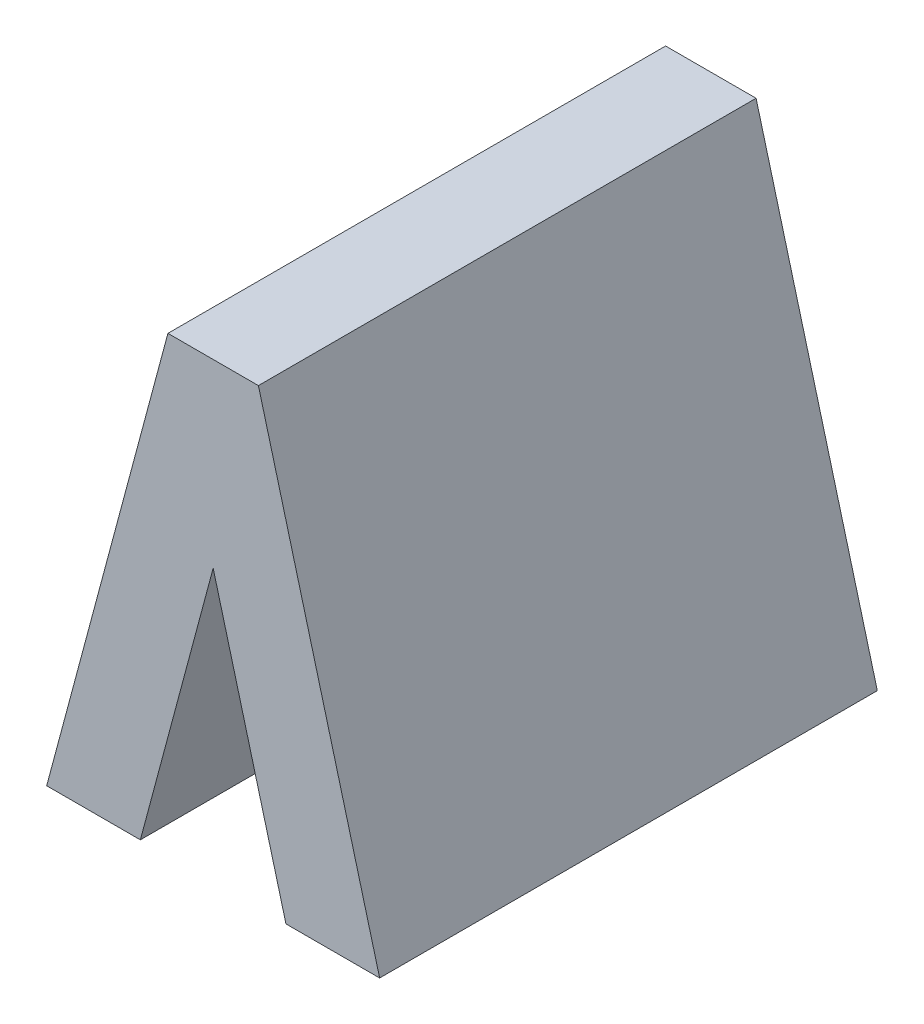
ISO-10303-21;
HEADER;
FILE_DESCRIPTION(('STEP AP214'),'2;1');
FILE_NAME('part.step','',(''),(''),'','','');
FILE_SCHEMA(('AUTOMOTIVE_DESIGN { 1 0 10303 214 1 1 1 1 }'));
ENDSEC;
DATA;
#1=APPLICATION_CONTEXT('core data for automotive mechanical design processes');
#2=APPLICATION_PROTOCOL_DEFINITION('international standard','automotive_design',2000,#1);
#3=PRODUCT_CONTEXT('',#1,'mechanical');
#4=PRODUCT('Part','Part','',(#3));
#5=PRODUCT_RELATED_PRODUCT_CATEGORY('part','',(#4));
#6=PRODUCT_DEFINITION_FORMATION('','',#4);
#7=PRODUCT_DEFINITION_CONTEXT('part definition',#1,'design');
#8=PRODUCT_DEFINITION('design','',#6,#7);
#9=PRODUCT_DEFINITION_SHAPE('','',#8);
#10=(LENGTH_UNIT() NAMED_UNIT(*) SI_UNIT(.MILLI.,.METRE.));
#11=(NAMED_UNIT(*) PLANE_ANGLE_UNIT() SI_UNIT($,.RADIAN.));
#12=(NAMED_UNIT(*) SI_UNIT($,.STERADIAN.) SOLID_ANGLE_UNIT());
#13=UNCERTAINTY_MEASURE_WITH_UNIT(LENGTH_MEASURE(1.E-05),#10,'distance_accuracy_value','');
#14=(GEOMETRIC_REPRESENTATION_CONTEXT(3) GLOBAL_UNCERTAINTY_ASSIGNED_CONTEXT((#13)) GLOBAL_UNIT_ASSIGNED_CONTEXT((#10,
#11,#12)) REPRESENTATION_CONTEXT('',''));
#15=CARTESIAN_POINT('',(0.,0.,0.));
#16=DIRECTION('',(0.,0.,1.));
#17=DIRECTION('',(1.,0.,0.));
#18=AXIS2_PLACEMENT_3D('',#15,#16,#17);
#19=CARTESIAN_POINT('',(19.626366102116,0.,110.));
#20=DIRECTION('',(-0.965925826289068,-0.258819045102521,0.));
#21=DIRECTION('',(0.258819045102521,-0.965925826289068,0.));
#22=AXIS2_PLACEMENT_3D('',#19,#20,#21);
#23=PLANE('',#22);
#24=DIRECTION('',(-0.258819045102521,0.965925826289068,0.));
#25=VECTOR('',#24,1.);
#26=CARTESIAN_POINT('',(19.626366102116,0.,0.));
#27=LINE('',#26,#25);
#28=CARTESIAN_POINT('',(46.4212853452283,-100.,0.));
#29=VERTEX_POINT('',#28);
#30=CARTESIAN_POINT('',(19.626366102116,0.,0.));
#31=VERTEX_POINT('',#30);
#32=EDGE_CURVE('E123',#29,#31,#27,.T.);
#33=ORIENTED_EDGE('',*,*,#32,.T.);
#34=DIRECTION('',(0.,0.,-1.));
#35=VECTOR('',#34,1.);
#36=CARTESIAN_POINT('',(19.626366102116,0.,110.));
#37=LINE('',#36,#35);
#38=CARTESIAN_POINT('',(19.626366102116,0.,110.));
#39=VERTEX_POINT('',#38);
#40=EDGE_CURVE('E11',#39,#31,#37,.T.);
#41=ORIENTED_EDGE('',*,*,#40,.F.);
#42=DIRECTION('',(-0.258819045102521,0.965925826289068,0.));
#43=VECTOR('',#42,1.);
#44=CARTESIAN_POINT('',(19.626366102116,0.,110.));
#45=LINE('',#44,#43);
#46=CARTESIAN_POINT('',(46.4212853452283,-100.,110.));
#47=VERTEX_POINT('',#46);
#48=EDGE_CURVE('E135',#47,#39,#45,.T.);
#49=ORIENTED_EDGE('',*,*,#48,.F.);
#50=DIRECTION('',(0.,0.,-1.));
#51=VECTOR('',#50,1.);
#52=CARTESIAN_POINT('',(46.4212853452283,-100.,110.));
#53=LINE('',#52,#51);
#54=EDGE_CURVE('E119',#47,#29,#53,.T.);
#55=ORIENTED_EDGE('',*,*,#54,.T.);
#56=EDGE_LOOP('',(#33,#41,#49,#55));
#57=FACE_BOUND('',#56,.T.);
#58=ADVANCED_FACE('F33',(#57),#23,.F.);
#59=CARTESIAN_POINT('',(-0.373633897884041,0.,110.));
#60=DIRECTION('',(0.,-1.,0.));
#61=DIRECTION('',(1.,0.,0.));
#62=AXIS2_PLACEMENT_3D('',#59,#60,#61);
#63=PLANE('',#62);
#64=DIRECTION('',(-1.,0.,0.));
#65=VECTOR('',#64,1.);
#66=CARTESIAN_POINT('',(-0.373633897884041,0.,0.));
#67=LINE('',#66,#65);
#68=CARTESIAN_POINT('',(-0.373633897884041,0.,0.));
#69=VERTEX_POINT('',#68);
#70=EDGE_CURVE('E126',#31,#69,#67,.T.);
#71=ORIENTED_EDGE('',*,*,#70,.T.);
#72=DIRECTION('',(0.,0.,-1.));
#73=VECTOR('',#72,1.);
#74=CARTESIAN_POINT('',(-0.373633897884041,0.,110.));
#75=LINE('',#74,#73);
#76=CARTESIAN_POINT('',(-0.373633897884041,0.,110.));
#77=VERTEX_POINT('',#76);
#78=EDGE_CURVE('E41',#77,#69,#75,.T.);
#79=ORIENTED_EDGE('',*,*,#78,.F.);
#80=DIRECTION('',(-1.,0.,0.));
#81=VECTOR('',#80,1.);
#82=CARTESIAN_POINT('',(-0.373633897884041,0.,110.));
#83=LINE('',#82,#81);
#84=EDGE_CURVE('E89',#39,#77,#83,.T.);
#85=ORIENTED_EDGE('',*,*,#84,.F.);
#86=ORIENTED_EDGE('',*,*,#40,.T.);
#87=EDGE_LOOP('',(#71,#79,#85,#86));
#88=FACE_BOUND('',#87,.T.);
#89=ADVANCED_FACE('F160',(#88),#63,.F.);
#90=CARTESIAN_POINT('',(-0.373633897884041,0.,110.));
#91=DIRECTION('',(0.965925826289068,-0.258819045102521,0.));
#92=DIRECTION('',(0.258819045102521,0.965925826289068,0.));
#93=AXIS2_PLACEMENT_3D('',#90,#91,#92);
#94=PLANE('',#93);
#95=DIRECTION('',(-0.258819045102521,-0.965925826289068,0.));
#96=VECTOR('',#95,1.);
#97=CARTESIAN_POINT('',(-0.373633897884041,0.,0.));
#98=LINE('',#97,#96);
#99=CARTESIAN_POINT('',(-27.1685531409964,-100.,0.));
#100=VERTEX_POINT('',#99);
#101=EDGE_CURVE('E128',#69,#100,#98,.T.);
#102=ORIENTED_EDGE('',*,*,#101,.T.);
#103=DIRECTION('',(0.,0.,-1.));
#104=VECTOR('',#103,1.);
#105=CARTESIAN_POINT('',(-27.1685531409964,-100.,110.));
#106=LINE('',#105,#104);
#107=CARTESIAN_POINT('',(-27.1685531409964,-100.,110.));
#108=VERTEX_POINT('',#107);
#109=EDGE_CURVE('E139',#108,#100,#106,.T.);
#110=ORIENTED_EDGE('',*,*,#109,.F.);
#111=DIRECTION('',(-0.258819045102521,-0.965925826289068,0.));
#112=VECTOR('',#111,1.);
#113=CARTESIAN_POINT('',(-0.373633897884041,0.,110.));
#114=LINE('',#113,#112);
#115=EDGE_CURVE('E147',#77,#108,#114,.T.);
#116=ORIENTED_EDGE('',*,*,#115,.F.);
#117=ORIENTED_EDGE('',*,*,#78,.T.);
#118=EDGE_LOOP('',(#102,#110,#116,#117));
#119=FACE_BOUND('',#118,.T.);
#120=ADVANCED_FACE('F145',(#119),#94,.F.);
#121=CARTESIAN_POINT('',(-6.4630295327947,-100.,110.));
#122=DIRECTION('',(0.,1.,0.));
#123=DIRECTION('',(0.,0.,1.));
#124=AXIS2_PLACEMENT_3D('',#121,#122,#123);
#125=PLANE('',#124);
#126=DIRECTION('',(1.,0.,0.));
#127=VECTOR('',#126,1.);
#128=CARTESIAN_POINT('',(-6.4630295327947,-100.,0.));
#129=LINE('',#128,#127);
#130=CARTESIAN_POINT('',(-6.4630295327947,-100.,0.));
#131=VERTEX_POINT('',#130);
#132=EDGE_CURVE('E130',#100,#131,#129,.T.);
#133=ORIENTED_EDGE('',*,*,#132,.T.);
#134=DIRECTION('',(0.,0.,-1.));
#135=VECTOR('',#134,1.);
#136=CARTESIAN_POINT('',(-6.4630295327947,-100.,110.));
#137=LINE('',#136,#135);
#138=CARTESIAN_POINT('',(-6.4630295327947,-100.,110.));
#139=VERTEX_POINT('',#138);
#140=EDGE_CURVE('E114',#139,#131,#137,.T.);
#141=ORIENTED_EDGE('',*,*,#140,.F.);
#142=DIRECTION('',(1.,0.,0.));
#143=VECTOR('',#142,1.);
#144=CARTESIAN_POINT('',(-6.4630295327947,-100.,110.));
#145=LINE('',#144,#143);
#146=EDGE_CURVE('E105',#108,#139,#145,.T.);
#147=ORIENTED_EDGE('',*,*,#146,.F.);
#148=ORIENTED_EDGE('',*,*,#109,.T.);
#149=EDGE_LOOP('',(#133,#141,#147,#148));
#150=FACE_BOUND('',#149,.T.);
#151=ADVANCED_FACE('F153',(#150),#125,.F.);
#152=CARTESIAN_POINT('',(9.62636610211596,-39.9535580274366,110.));
#153=DIRECTION('',(-0.965925826289068,0.258819045102521,0.));
#154=DIRECTION('',(-0.258819045102521,-0.965925826289068,0.));
#155=AXIS2_PLACEMENT_3D('',#152,#153,#154);
#156=PLANE('',#155);
#157=DIRECTION('',(0.258819045102521,0.965925826289068,0.));
#158=VECTOR('',#157,1.);
#159=CARTESIAN_POINT('',(9.62636610211596,-39.9535580274366,0.));
#160=LINE('',#159,#158);
#161=CARTESIAN_POINT('',(9.62636610211596,-39.9535580274366,0.));
#162=VERTEX_POINT('',#161);
#163=EDGE_CURVE('E113',#131,#162,#160,.T.);
#164=ORIENTED_EDGE('',*,*,#163,.T.);
#165=DIRECTION('',(0.,0.,-1.));
#166=VECTOR('',#165,1.);
#167=CARTESIAN_POINT('',(9.62636610211596,-39.9535580274366,110.));
#168=LINE('',#167,#166);
#169=CARTESIAN_POINT('',(9.62636610211596,-39.9535580274366,110.));
#170=VERTEX_POINT('',#169);
#171=EDGE_CURVE('E110',#170,#162,#168,.T.);
#172=ORIENTED_EDGE('',*,*,#171,.F.);
#173=DIRECTION('',(0.258819045102521,0.965925826289068,0.));
#174=VECTOR('',#173,1.);
#175=CARTESIAN_POINT('',(9.62636610211596,-39.9535580274366,110.));
#176=LINE('',#175,#174);
#177=EDGE_CURVE('E99',#139,#170,#176,.T.);
#178=ORIENTED_EDGE('',*,*,#177,.F.);
#179=ORIENTED_EDGE('',*,*,#140,.T.);
#180=EDGE_LOOP('',(#164,#172,#178,#179));
#181=FACE_BOUND('',#180,.T.);
#182=ADVANCED_FACE('F111',(#181),#156,.F.);
#183=CARTESIAN_POINT('',(9.62636610211596,-39.9535580274366,110.));
#184=DIRECTION('',(0.965925826289068,0.258819045102521,0.));
#185=DIRECTION('',(-0.258819045102521,0.965925826289068,0.));
#186=AXIS2_PLACEMENT_3D('',#183,#184,#185);
#187=PLANE('',#186);
#188=DIRECTION('',(0.258819045102521,-0.965925826289068,0.));
#189=VECTOR('',#188,1.);
#190=CARTESIAN_POINT('',(9.62636610211596,-39.9535580274366,0.));
#191=LINE('',#190,#189);
#192=CARTESIAN_POINT('',(25.7157617370266,-100.,0.));
#193=VERTEX_POINT('',#192);
#194=EDGE_CURVE('E75',#162,#193,#191,.T.);
#195=ORIENTED_EDGE('',*,*,#194,.T.);
#196=DIRECTION('',(0.,0.,-1.));
#197=VECTOR('',#196,1.);
#198=CARTESIAN_POINT('',(25.7157617370266,-100.,110.));
#199=LINE('',#198,#197);
#200=CARTESIAN_POINT('',(25.7157617370266,-100.,110.));
#201=VERTEX_POINT('',#200);
#202=EDGE_CURVE('E115',#201,#193,#199,.T.);
#203=ORIENTED_EDGE('',*,*,#202,.F.);
#204=DIRECTION('',(0.258819045102521,-0.965925826289068,0.));
#205=VECTOR('',#204,1.);
#206=CARTESIAN_POINT('',(9.62636610211596,-39.9535580274366,110.));
#207=LINE('',#206,#205);
#208=EDGE_CURVE('E103',#170,#201,#207,.T.);
#209=ORIENTED_EDGE('',*,*,#208,.F.);
#210=ORIENTED_EDGE('',*,*,#171,.T.);
#211=EDGE_LOOP('',(#195,#203,#209,#210));
#212=FACE_BOUND('',#211,.T.);
#213=ADVANCED_FACE('F117',(#212),#187,.F.);
#214=CARTESIAN_POINT('',(25.7157617370266,-100.,110.));
#215=DIRECTION('',(0.,1.,0.));
#216=DIRECTION('',(-1.,0.,0.));
#217=AXIS2_PLACEMENT_3D('',#214,#215,#216);
#218=PLANE('',#217);
#219=DIRECTION('',(1.,0.,0.));
#220=VECTOR('',#219,1.);
#221=CARTESIAN_POINT('',(25.7157617370266,-100.,0.));
#222=LINE('',#221,#220);
#223=EDGE_CURVE('E81',#193,#29,#222,.T.);
#224=ORIENTED_EDGE('',*,*,#223,.T.);
#225=ORIENTED_EDGE('',*,*,#54,.F.);
#226=DIRECTION('',(1.,0.,0.));
#227=VECTOR('',#226,1.);
#228=CARTESIAN_POINT('',(25.7157617370266,-100.,110.));
#229=LINE('',#228,#227);
#230=EDGE_CURVE('E49',#201,#47,#229,.T.);
#231=ORIENTED_EDGE('',*,*,#230,.F.);
#232=ORIENTED_EDGE('',*,*,#202,.T.);
#233=EDGE_LOOP('',(#224,#225,#231,#232));
#234=FACE_BOUND('',#233,.T.);
#235=ADVANCED_FACE('F174',(#234),#218,.F.);
#236=CARTESIAN_POINT('',(0.,0.,110.));
#237=DIRECTION('',(0.,0.,1.));
#238=DIRECTION('',(1.,0.,0.));
#239=AXIS2_PLACEMENT_3D('',#236,#237,#238);
#240=PLANE('',#239);
#241=ORIENTED_EDGE('',*,*,#48,.T.);
#242=ORIENTED_EDGE('',*,*,#84,.T.);
#243=ORIENTED_EDGE('',*,*,#115,.T.);
#244=ORIENTED_EDGE('',*,*,#146,.T.);
#245=ORIENTED_EDGE('',*,*,#177,.T.);
#246=ORIENTED_EDGE('',*,*,#208,.T.);
#247=ORIENTED_EDGE('',*,*,#230,.T.);
#248=EDGE_LOOP('',(#241,#242,#243,#244,#245,#246,#247));
#249=FACE_BOUND('',#248,.T.);
#250=ADVANCED_FACE('F101',(#249),#240,.T.);
#251=CARTESIAN_POINT('',(0.,0.,0.));
#252=DIRECTION('',(0.,0.,1.));
#253=DIRECTION('',(1.,0.,0.));
#254=AXIS2_PLACEMENT_3D('',#251,#252,#253);
#255=PLANE('',#254);
#256=ORIENTED_EDGE('',*,*,#32,.F.);
#257=ORIENTED_EDGE('',*,*,#223,.F.);
#258=ORIENTED_EDGE('',*,*,#194,.F.);
#259=ORIENTED_EDGE('',*,*,#163,.F.);
#260=ORIENTED_EDGE('',*,*,#132,.F.);
#261=ORIENTED_EDGE('',*,*,#101,.F.);
#262=ORIENTED_EDGE('',*,*,#70,.F.);
#263=EDGE_LOOP('',(#256,#257,#258,#259,#260,#261,#262));
#264=FACE_BOUND('',#263,.T.);
#265=ADVANCED_FACE('F151',(#264),#255,.F.);
#266=CLOSED_SHELL('',(#58,#89,#120,#151,#182,#213,#235,#250,#265));
#267=MANIFOLD_SOLID_BREP('B2',#266);
#268=ADVANCED_BREP_SHAPE_REPRESENTATION('',(#18,#267),#14);
#269=SHAPE_DEFINITION_REPRESENTATION(#9,#268);
ENDSEC;
END-ISO-10303-21;
